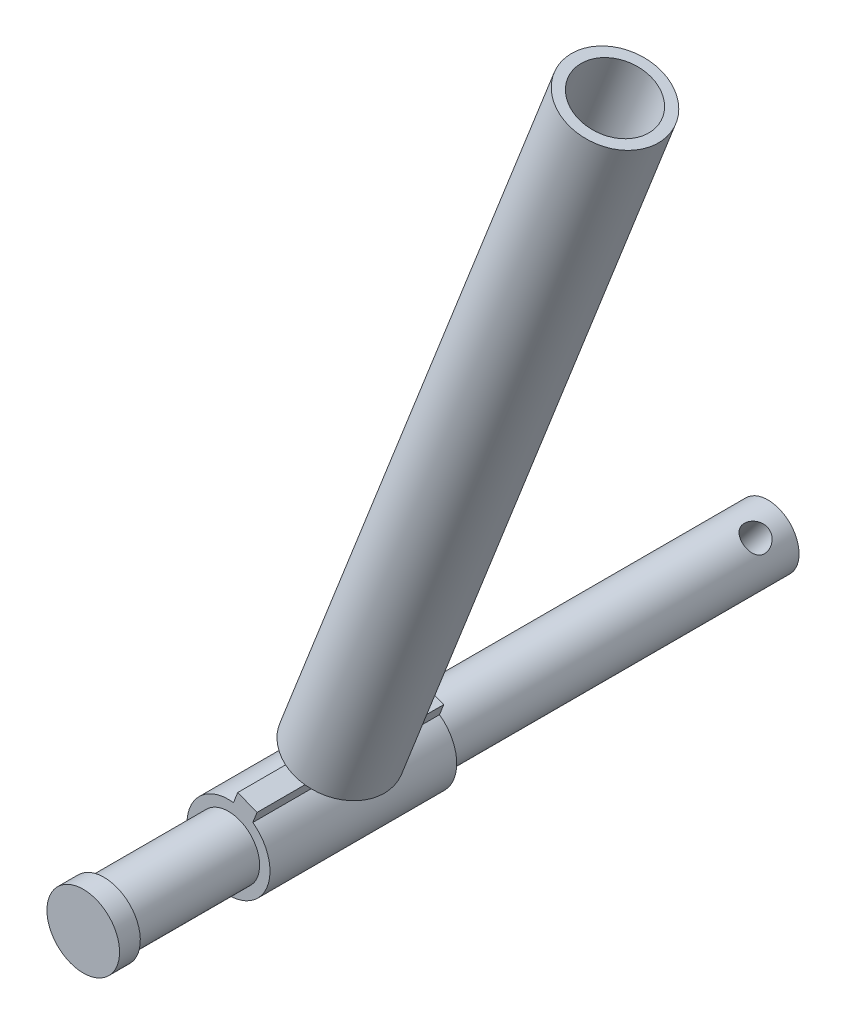
ISO-10303-21;
HEADER;
FILE_DESCRIPTION(('STEP AP214'),'2;1');
FILE_NAME('part.step','',(''),(''),'','','');
FILE_SCHEMA(('AUTOMOTIVE_DESIGN { 1 0 10303 214 1 1 1 1 }'));
ENDSEC;
DATA;
#1=APPLICATION_CONTEXT('core data for automotive mechanical design processes');
#2=APPLICATION_PROTOCOL_DEFINITION('international standard','automotive_design',2000,#1);
#3=PRODUCT_CONTEXT('',#1,'mechanical');
#4=PRODUCT('Part','Part','',(#3));
#5=PRODUCT_RELATED_PRODUCT_CATEGORY('part','',(#4));
#6=PRODUCT_DEFINITION_FORMATION('','',#4);
#7=PRODUCT_DEFINITION_CONTEXT('part definition',#1,'design');
#8=PRODUCT_DEFINITION('design','',#6,#7);
#9=PRODUCT_DEFINITION_SHAPE('','',#8);
#10=(LENGTH_UNIT() NAMED_UNIT(*) SI_UNIT(.MILLI.,.METRE.));
#11=(NAMED_UNIT(*) PLANE_ANGLE_UNIT() SI_UNIT($,.RADIAN.));
#12=(NAMED_UNIT(*) SI_UNIT($,.STERADIAN.) SOLID_ANGLE_UNIT());
#13=UNCERTAINTY_MEASURE_WITH_UNIT(LENGTH_MEASURE(1.E-05),#10,'distance_accuracy_value','');
#14=(GEOMETRIC_REPRESENTATION_CONTEXT(3) GLOBAL_UNCERTAINTY_ASSIGNED_CONTEXT((#13)) GLOBAL_UNIT_ASSIGNED_CONTEXT((#10,
#11,#12)) REPRESENTATION_CONTEXT('',''));
#15=CARTESIAN_POINT('',(0.,0.,0.));
#16=DIRECTION('',(0.,0.,1.));
#17=DIRECTION('',(1.,0.,0.));
#18=AXIS2_PLACEMENT_3D('',#15,#16,#17);
#19=CARTESIAN_POINT('',(-602.469625856057,201.390217780142,4239.13224485644));
#20=DIRECTION('',(0.,0.,-1.));
#21=DIRECTION('',(-0.622995613228405,-0.78222532936371,0.));
#22=AXIS2_PLACEMENT_3D('',#19,#20,#21);
#23=PLANE('',#22);
#24=CARTESIAN_POINT('',(-602.469625856057,201.390217780142,4239.13224485644));
#25=DIRECTION('',(0.,0.,1.));
#26=DIRECTION('',(0.622995613228405,0.78222532936371,0.));
#27=AXIS2_PLACEMENT_3D('',#24,#25,#26);
#28=CIRCLE('',#27,35.);
#29=CARTESIAN_POINT('',(-580.664779393063,228.768104307871,4239.13224485644));
#30=VERTEX_POINT('',#29);
#31=EDGE_CURVE('P0_E30',#30,#30,#28,.T.);
#32=ORIENTED_EDGE('',*,*,#31,.T.);
#33=EDGE_LOOP('',(#32));
#34=FACE_BOUND('',#33,.T.);
#35=ADVANCED_FACE('P0_F15',(#34),#23,.F.);
#36=CARTESIAN_POINT('',(-602.469625856057,201.390217780142,4239.13224485644));
#37=DIRECTION('',(0.,0.,1.));
#38=DIRECTION('',(0.622995613228405,0.78222532936371,0.));
#39=AXIS2_PLACEMENT_3D('',#36,#37,#38);
#40=CYLINDRICAL_SURFACE('',#39,35.);
#41=ORIENTED_EDGE('',*,*,#31,.F.);
#42=EDGE_LOOP('',(#41));
#43=FACE_BOUND('',#42,.T.);
#44=CARTESIAN_POINT('',(-602.469625856057,201.390217780142,4219.13224485644));
#45=DIRECTION('',(0.,0.,1.));
#46=DIRECTION('',(0.622995613228405,0.78222532936371,0.));
#47=AXIS2_PLACEMENT_3D('',#44,#45,#46);
#48=CIRCLE('',#47,35.);
#49=CARTESIAN_POINT('',(-580.664779393063,228.768104307871,4219.13224485644));
#50=VERTEX_POINT('',#49);
#51=EDGE_CURVE('P0_E34',#50,#50,#48,.T.);
#52=ORIENTED_EDGE('',*,*,#51,.T.);
#53=EDGE_LOOP('',(#52));
#54=FACE_BOUND('',#53,.T.);
#55=ADVANCED_FACE('P0_F59',(#43,#54),#40,.T.);
#56=CARTESIAN_POINT('',(-629.847512383787,223.195064243136,4219.13224485644));
#57=DIRECTION('',(0.,0.,1.));
#58=DIRECTION('',(0.622995613228405,0.78222532936371,0.));
#59=AXIS2_PLACEMENT_3D('',#56,#57,#58);
#60=PLANE('',#59);
#61=ORIENTED_EDGE('',*,*,#51,.F.);
#62=EDGE_LOOP('',(#61));
#63=FACE_BOUND('',#62,.T.);
#64=CARTESIAN_POINT('',(-602.469625856057,201.390217780142,4219.13224485644));
#65=DIRECTION('',(0.,0.,1.));
#66=DIRECTION('',(0.622995613228405,0.78222532936371,0.));
#67=AXIS2_PLACEMENT_3D('',#64,#65,#66);
#68=CIRCLE('',#67,30.);
#69=CARTESIAN_POINT('',(-583.779757459205,224.856977661053,4219.13224485644));
#70=VERTEX_POINT('',#69);
#71=EDGE_CURVE('P0_E70',#70,#70,#68,.T.);
#72=ORIENTED_EDGE('',*,*,#71,.T.);
#73=EDGE_LOOP('',(#72));
#74=FACE_BOUND('',#73,.T.);
#75=ADVANCED_FACE('P0_F56',(#63,#74),#60,.F.);
#76=CARTESIAN_POINT('',(-602.469625856057,201.390217780142,4239.13224485644));
#77=DIRECTION('',(0.,0.,1.));
#78=DIRECTION('',(0.622995613228405,0.78222532936371,0.));
#79=AXIS2_PLACEMENT_3D('',#76,#77,#78);
#80=CYLINDRICAL_SURFACE('',#79,30.);
#81=CARTESIAN_POINT('',(-621.159494252909,177.92345789923,3596.63224485644));
#82=CARTESIAN_POINT('',(-621.421482284155,178.132117989513,3596.63224711897));
#83=CARTESIAN_POINT('',(-621.680057320578,178.34524516387,3596.64572430932));
#84=CARTESIAN_POINT('',(-622.188423321345,178.778699783763,3596.69950779839));
#85=CARTESIAN_POINT('',(-622.438208621806,178.999031701638,3596.73983107441));
#86=CARTESIAN_POINT('',(-622.927807194417,179.44545067377,3596.84701447726));
#87=CARTESIAN_POINT('',(-623.167595780304,179.671549981808,3596.91393644166));
#88=CARTESIAN_POINT('',(-623.635147371634,180.126934896082,3597.07361676067));
#89=CARTESIAN_POINT('',(-623.862912227662,180.356220005085,3597.16637112552));
#90=CARTESIAN_POINT('',(-624.304631165095,180.815144435317,3597.37647442761));
#91=CARTESIAN_POINT('',(-624.518629292982,181.044779944805,3597.49373924101));
#92=CARTESIAN_POINT('',(-624.932872474032,181.503086780619,3597.7520293677));
#93=CARTESIAN_POINT('',(-625.13311703681,181.731758072292,3597.89305552757));
#94=CARTESIAN_POINT('',(-625.519209880109,182.185909246714,3598.19766066244));
#95=CARTESIAN_POINT('',(-625.705066395984,182.411390893817,3598.36122658493));
#96=CARTESIAN_POINT('',(-626.062280032031,182.857319228899,3598.70987659999));
#97=CARTESIAN_POINT('',(-626.233631443883,183.07776390995,3598.8949690967));
#98=CARTESIAN_POINT('',(-626.56909879548,183.521356360144,3599.29432871526));
#99=CARTESIAN_POINT('',(-626.732531585096,183.74417135548,3599.50953966012));
#100=CARTESIAN_POINT('',(-627.043424572472,184.179754067719,3599.96089227816));
#101=CARTESIAN_POINT('',(-627.190877438101,184.392517147418,3600.19704346984));
#102=CARTESIAN_POINT('',(-627.469906520271,184.805642863071,3600.68891726648));
#103=CARTESIAN_POINT('',(-627.601478036135,185.006001819055,3600.94464562961));
#104=CARTESIAN_POINT('',(-627.848894958806,185.391928792453,3601.47422870519));
#105=CARTESIAN_POINT('',(-627.964740360663,185.577496805209,3601.74808342335));
#106=CARTESIAN_POINT('',(-628.186299777155,185.94029598417,3602.32647908292));
#107=CARTESIAN_POINT('',(-628.291227130929,186.116658172214,3602.63186819507));
#108=CARTESIAN_POINT('',(-628.484235231575,186.447767303847,3603.25908009123));
#109=CARTESIAN_POINT('',(-628.572322954428,186.602523190863,3603.58089599997));
#110=CARTESIAN_POINT('',(-628.731926091562,186.887861935616,3604.23898238218));
#111=CARTESIAN_POINT('',(-628.803444429465,187.018449057047,3604.57525029319));
#112=CARTESIAN_POINT('',(-628.930110213646,187.253012862734,3605.25993631323));
#113=CARTESIAN_POINT('',(-628.98525887892,187.356991528356,3605.60835351538));
#114=CARTESIAN_POINT('',(-629.077060038233,187.531872655018,3606.29765177137));
#115=CARTESIAN_POINT('',(-629.114475006528,187.604126216704,3606.63808842232));
#116=CARTESIAN_POINT('',(-629.174675252514,187.721103552286,3607.32494369053));
#117=CARTESIAN_POINT('',(-629.197460982396,187.765828177099,3607.67136212256));
#118=CARTESIAN_POINT('',(-629.22843810938,187.82676907121,3608.3671844825));
#119=CARTESIAN_POINT('',(-629.236636418324,187.842998841951,3608.71658691762));
#120=CARTESIAN_POINT('',(-629.238473539474,187.846628647459,3609.41557072255));
#121=CARTESIAN_POINT('',(-629.232113118068,187.834030199779,3609.76515208198));
#122=CARTESIAN_POINT('',(-629.205873250039,187.782359243931,3610.43476999411));
#123=CARTESIAN_POINT('',(-629.187069239716,187.745393585696,3610.7550142397));
#124=CARTESIAN_POINT('',(-629.137017409223,187.647829652539,3611.39087425213));
#125=CARTESIAN_POINT('',(-629.105770324898,187.587232775096,3611.70649029154));
#126=CARTESIAN_POINT('',(-629.030774879996,187.443464677609,3612.33105502277));
#127=CARTESIAN_POINT('',(-628.987024784659,187.360290325078,3612.64000278298));
#128=CARTESIAN_POINT('',(-628.886943526315,187.172742193491,3613.24930214861));
#129=CARTESIAN_POINT('',(-628.830611870884,187.068367584701,3613.54965341706));
#130=CARTESIAN_POINT('',(-628.703938022011,186.837604927456,3614.14627497902));
#131=CARTESIAN_POINT('',(-628.633326042801,186.710800010213,3614.44232653354));
#132=CARTESIAN_POINT('',(-628.478694224009,186.438533286742,3615.02221221047));
#133=CARTESIAN_POINT('',(-628.394669501058,186.293064689162,3615.30604183511));
#134=CARTESIAN_POINT('',(-628.213040528292,185.985396916665,3615.85999776267));
#135=CARTESIAN_POINT('',(-628.115434464148,185.823195507164,3616.13012222814));
#136=CARTESIAN_POINT('',(-627.906456280501,185.484013502982,3616.65535576602));
#137=CARTESIAN_POINT('',(-627.795083388556,185.307032079192,3616.9104639947));
#138=CARTESIAN_POINT('',(-627.548335622131,184.924666809615,3617.42542517008));
#139=CARTESIAN_POINT('',(-627.411726206545,184.718147137876,3617.6838455239));
#140=CARTESIAN_POINT('',(-627.121932722506,184.292556815289,3618.18003124467));
#141=CARTESIAN_POINT('',(-626.968755116661,184.073491073752,3618.41780460044));
#142=CARTESIAN_POINT('',(-626.645540593293,183.625039010097,3618.87152983598));
#143=CARTESIAN_POINT('',(-626.475492580485,183.395645950826,3619.08746716368));
#144=CARTESIAN_POINT('',(-626.118698446247,182.929244641047,3619.49581477322));
#145=CARTESIAN_POINT('',(-625.931959156957,182.692239531554,3619.68823460566));
#146=CARTESIAN_POINT('',(-625.537345604947,182.207406513967,3620.05243024578));
#147=CARTESIAN_POINT('',(-625.329079158514,181.959455124243,3620.22361791769));
#148=CARTESIAN_POINT('',(-624.895665663451,181.46079606405,3620.53845424543));
#149=CARTESIAN_POINT('',(-624.670518182606,181.21008832315,3620.68210219581));
#150=CARTESIAN_POINT('',(-624.204270921059,180.708769265101,3620.94037860233));
#151=CARTESIAN_POINT('',(-623.963178317043,180.458157954953,3621.05502000331));
#152=CARTESIAN_POINT('',(-623.466169948327,179.959656169659,3621.25410679205));
#153=CARTESIAN_POINT('',(-623.210255311284,179.711765489232,3621.33855447345));
#154=CARTESIAN_POINT('',(-622.701846668615,179.236877344591,3621.47190450584));
#155=CARTESIAN_POINT('',(-622.450160441198,179.009550206144,3621.52271754466));
#156=CARTESIAN_POINT('',(-621.936867074245,178.561671866484,3621.59642229088));
#157=CARTESIAN_POINT('',(-621.67526035281,178.341120380418,3621.61931517364));
#158=CARTESIAN_POINT('',(-621.144129565625,177.908732446825,3621.63691821616));
#159=CARTESIAN_POINT('',(-620.874607482131,177.696893848685,3621.63163537317));
#160=CARTESIAN_POINT('',(-620.329749325245,177.283519196645,3621.59296341511));
#161=CARTESIAN_POINT('',(-620.054413381277,177.081982913742,3621.55957492508));
#162=CARTESIAN_POINT('',(-619.514040689571,176.700303448042,3621.46742410839));
#163=CARTESIAN_POINT('',(-619.249172479816,176.519594816812,3621.41000584398));
#164=CARTESIAN_POINT('',(-618.718354234068,176.169593499989,3621.27069905598));
#165=CARTESIAN_POINT('',(-618.452404243396,176.000300341264,3621.18881154732));
#166=CARTESIAN_POINT('',(-617.921474609259,175.67373428353,3621.00131338546));
#167=CARTESIAN_POINT('',(-617.656495039557,175.516462280907,3620.89570096547));
#168=CARTESIAN_POINT('',(-617.129571563591,175.214308142493,3620.66165511139));
#169=CARTESIAN_POINT('',(-616.867627768409,175.069426458841,3620.53322084504));
#170=CARTESIAN_POINT('',(-616.340777906559,174.787904348591,3620.25023051822));
#171=CARTESIAN_POINT('',(-616.076029662685,174.651655936167,3620.0949909568));
#172=CARTESIAN_POINT('',(-615.553924267991,174.392326306977,3619.76242189304));
#173=CARTESIAN_POINT('',(-615.296569890105,174.269249984198,3619.58508423291));
#174=CARTESIAN_POINT('',(-614.791364389855,174.036019076891,3619.20951582883));
#175=CARTESIAN_POINT('',(-614.543514846368,173.925866632982,3619.01128163402));
#176=CARTESIAN_POINT('',(-614.059358663014,173.718074629601,3618.59512969407));
#177=CARTESIAN_POINT('',(-613.823052584253,173.620435678013,3618.37721099356));
#178=CARTESIAN_POINT('',(-613.347471306833,173.430556571643,3617.90656612591));
#179=CARTESIAN_POINT('',(-613.109200026933,173.339206704615,3617.65246433251));
#180=CARTESIAN_POINT('',(-612.650686944408,173.169556165056,3617.12460968829));
#181=CARTESIAN_POINT('',(-612.430437869211,173.091250215516,3616.85086484866));
#182=CARTESIAN_POINT('',(-612.010112317298,172.94679062896,3616.28496230889));
#183=CARTESIAN_POINT('',(-611.810049716512,172.880645325688,3615.99279216461));
#184=CARTESIAN_POINT('',(-611.432758852658,172.759788428677,3615.39198044493));
#185=CARTESIAN_POINT('',(-611.255520886002,172.705071969924,3615.08334594856));
#186=CARTESIAN_POINT('',(-610.923755613615,172.605531920257,3614.44669974147));
#187=CARTESIAN_POINT('',(-610.769596687991,172.560864026555,3614.11847127502));
#188=CARTESIAN_POINT('',(-610.48951320555,172.4816963655,3613.44896660675));
#189=CARTESIAN_POINT('',(-610.363589146295,172.447196777332,3613.10769017512));
#190=CARTESIAN_POINT('',(-610.142230048023,172.387730097653,3612.41481984093));
#191=CARTESIAN_POINT('',(-610.046774022261,172.362756442242,3612.0632332232));
#192=CARTESIAN_POINT('',(-609.888052412892,172.321786502914,3611.35235803411));
#193=CARTESIAN_POINT('',(-609.824783801812,172.305789374669,3610.99307019043));
#194=CARTESIAN_POINT('',(-609.735297415765,172.283312109091,3610.29777920122));
#195=CARTESIAN_POINT('',(-609.706601393787,172.276193893622,3609.96211388237));
#196=CARTESIAN_POINT('',(-609.678230218126,172.269155838887,3609.289489979));
#197=CARTESIAN_POINT('',(-609.678553510497,172.269235614178,3608.95253146469));
#198=CARTESIAN_POINT('',(-609.708211603383,172.276593769814,3608.28002647428));
#199=CARTESIAN_POINT('',(-609.737542374069,172.28387115024,3607.94447980855));
#200=CARTESIAN_POINT('',(-609.824678185323,172.30576804059,3607.27735496567));
#201=CARTESIAN_POINT('',(-609.88248299708,172.320387491515,3606.94577675666));
#202=CARTESIAN_POINT('',(-610.022202807929,172.35638383906,3606.30444819574));
#203=CARTESIAN_POINT('',(-610.102861272397,172.377412034566,3605.99440302703));
#204=CARTESIAN_POINT('',(-610.287965112056,172.426745271931,3605.38198358697));
#205=CARTESIAN_POINT('',(-610.392418697208,172.455052825802,3605.07961200334));
#206=CARTESIAN_POINT('',(-610.623669390627,172.519368062465,3604.48439711523));
#207=CARTESIAN_POINT('',(-610.750466570195,172.555375769829,3604.19155384116));
#208=CARTESIAN_POINT('',(-611.024831776108,172.63558563291,3603.61692218361));
#209=CARTESIAN_POINT('',(-611.172401320223,172.679788387487,3603.33513460986));
#210=CARTESIAN_POINT('',(-611.496095711829,172.779848530578,3602.7674274788));
#211=CARTESIAN_POINT('',(-611.673403789469,172.836246748165,3602.48227762629));
#212=CARTESIAN_POINT('',(-612.047466837636,172.959534817087,3601.92742669338));
#213=CARTESIAN_POINT('',(-612.244222394632,173.026424984859,3601.65772607927));
#214=CARTESIAN_POINT('',(-612.655195577396,173.171400500578,3601.13505751352));
#215=CARTESIAN_POINT('',(-612.869417396121,173.249488540125,3600.88209360625));
#216=CARTESIAN_POINT('',(-613.313273538809,173.417523581661,3600.39421883975));
#217=CARTESIAN_POINT('',(-613.542909914949,173.507472164216,3600.15931039325));
#218=CARTESIAN_POINT('',(-614.0328292299,173.706878584822,3599.69234614424));
#219=CARTESIAN_POINT('',(-614.294125351153,173.81728188638,3599.46175405353));
#220=CARTESIAN_POINT('',(-614.829456255655,174.053061818535,3599.02444697617));
#221=CARTESIAN_POINT('',(-615.103486468779,174.178433102254,3598.81772351474));
#222=CARTESIAN_POINT('',(-615.661983497476,174.444764244571,3598.42944053703));
#223=CARTESIAN_POINT('',(-615.946457873147,174.58573555021,3598.24789972244));
#224=CARTESIAN_POINT('',(-616.52293521724,174.883431823155,3597.91169541693));
#225=CARTESIAN_POINT('',(-616.814937567675,175.040155500362,3597.75702972779));
#226=CARTESIAN_POINT('',(-617.398825111315,175.366593547177,3597.47833701068));
#227=CARTESIAN_POINT('',(-617.690632501414,175.536050447404,3597.35384591318));
#228=CARTESIAN_POINT('',(-618.276154930358,175.88981348428,3597.13349137765));
#229=CARTESIAN_POINT('',(-618.569870279627,176.074122095905,3597.03763272368));
#230=CARTESIAN_POINT('',(-619.15551586051,176.456244906136,3596.87586354881));
#231=CARTESIAN_POINT('',(-619.447448789068,176.654019701884,3596.80986963695));
#232=CARTESIAN_POINT('',(-620.027462590281,177.062292391624,3596.70825008318));
#233=CARTESIAN_POINT('',(-620.315546137238,177.272780824443,3596.67260214961));
#234=CARTESIAN_POINT('',(-620.694291142813,177.560078723277,3596.64563042869));
#235=CARTESIAN_POINT('',(-620.787883977407,177.631948540553,3596.64061219946));
#236=CARTESIAN_POINT('',(-620.974290774387,177.776846359797,3596.63391900961));
#237=CARTESIAN_POINT('',(-621.067104734541,177.849874365081,3596.63224405856));
#238=CARTESIAN_POINT('',(-621.159494252909,177.92345789923,3596.63224485644));
#239=B_SPLINE_CURVE_WITH_KNOTS('',3,(#81,#82,#83,#84,#85,#86,#87,#88,#89,#90,#91,#92,#93,#94,
#95,#96,#97,#98,#99,#100,#101,#102,#103,#104,#105,#106,#107,#108,#109,#110,#111,#112,#113,#114,
#115,#116,#117,#118,#119,#120,#121,#122,#123,#124,#125,#126,#127,#128,#129,#130,#131,#132,#133,
#134,#135,#136,#137,#138,#139,#140,#141,#142,#143,#144,#145,#146,#147,#148,#149,#150,#151,#152,
#153,#154,#155,#156,#157,#158,#159,#160,#161,#162,#163,#164,#165,#166,#167,#168,#169,#170,#171,
#172,#173,#174,#175,#176,#177,#178,#179,#180,#181,#182,#183,#184,#185,#186,#187,#188,#189,#190,
#191,#192,#193,#194,#195,#196,#197,#198,#199,#200,#201,#202,#203,#204,#205,#206,#207,#208,#209,
#210,#211,#212,#213,#214,#215,#216,#217,#218,#219,#220,#221,#222,#223,#224,#225,#226,#227,#228,
#229,#230,#231,#232,#233,#234,#235,#236,#237,#238),.UNSPECIFIED.,.T.,.F.,(4,2,2,2,2,2,2,2,2,2,2,
2,2,2,2,2,2,2,2,2,2,2,2,2,2,2,2,2,2,2,2,2,2,2,2,2,2,2,2,2,2,2,2,2,2,2,2,2,2,2,2,2,2,2,2,2,2,2,2,
2,2,2,2,2,2,2,2,2,2,2,2,2,2,2,2,2,2,2,4),(0.,1.00466377798185,2.00996350323173,3.01761418533847,
4.02510932397558,5.02920174469292,6.03332994784078,7.03687909749923,8.04082136416411,
9.0904076316209,10.1404734638638,11.1908493439957,12.2412255547517,13.343658924492,
14.4456346059817,15.5474156984468,16.6491147242288,17.6977885376054,18.7464299349201,
19.7945743304077,20.8426635516396,21.8102841128417,22.7778474605276,23.7455451204138,
24.7132806612804,25.7013724558905,26.6898248231238,27.6784093645777,28.6670493997115,
29.7395376959963,30.8116091546478,31.8843904244264,32.956734572654,34.0541608742381,
35.1516152834554,36.2485790611892,37.3454594916022,38.3729497094307,39.4003966716773,
40.427588486896,41.4547574593452,42.4308578770206,43.4069178137517,44.3830504617576,
45.359218714891,46.3654951807195,47.3721442322,48.3789597832712,49.3858242252434,
50.4649453336419,51.5436288101092,52.623048779763,53.7020083227622,54.7966829194204,
55.8913768051429,56.9853150171764,58.079150316951,59.0887421835191,60.0982799878473,
61.1076775630543,62.1170670271052,63.0791633380625,64.0415921024082,65.0040239380319,
65.9665261320114,66.9868817454613,68.0072681387293,69.0279002116256,70.0486684342963,
71.1440527390739,72.2390469136825,73.3348499727185,74.4305633598348,75.508170036637,
76.5859566649334,77.660714947081,78.7346830461985,79.0889745622273,79.4432670928012),.UNSPECIFIED.);
#240=CARTESIAN_POINT('',(-621.159494252909,177.92345789923,3596.63224485644));
#241=VERTEX_POINT('',#240);
#242=EDGE_CURVE('P0_E10',#241,#241,#239,.T.);
#243=ORIENTED_EDGE('',*,*,#242,.T.);
#244=EDGE_LOOP('',(#243));
#245=FACE_BOUND('',#244,.T.);
#246=CARTESIAN_POINT('',(-583.779757459205,224.856977661053,3596.63224485644));
#247=CARTESIAN_POINT('',(-583.517769427959,224.64831757077,3596.63224711897));
#248=CARTESIAN_POINT('',(-583.259194391536,224.435190396413,3596.64572430932));
#249=CARTESIAN_POINT('',(-582.750828390769,224.00173577652,3596.69950779839));
#250=CARTESIAN_POINT('',(-582.501043090308,223.781403858645,3596.73983107441));
#251=CARTESIAN_POINT('',(-582.011444517697,223.334984886513,3596.84701447726));
#252=CARTESIAN_POINT('',(-581.77165593181,223.108885578475,3596.91393644166));
#253=CARTESIAN_POINT('',(-581.30410434048,222.653500664201,3597.07361676067));
#254=CARTESIAN_POINT('',(-581.076339484452,222.424215555198,3597.16637112552));
#255=CARTESIAN_POINT('',(-580.634620547019,221.965291124966,3597.37647442761));
#256=CARTESIAN_POINT('',(-580.420622419132,221.735655615478,3597.49373924101));
#257=CARTESIAN_POINT('',(-580.006379238082,221.277348779665,3597.7520293677));
#258=CARTESIAN_POINT('',(-579.806134675304,221.048677487991,3597.89305552757));
#259=CARTESIAN_POINT('',(-579.420041832005,220.594526313569,3598.19766066244));
#260=CARTESIAN_POINT('',(-579.23418531613,220.369044666466,3598.36122658493));
#261=CARTESIAN_POINT('',(-578.876971680083,219.923116331384,3598.70987659999));
#262=CARTESIAN_POINT('',(-578.705620268231,219.702671650333,3598.8949690967));
#263=CARTESIAN_POINT('',(-578.370152916634,219.25907920014,3599.29432871526));
#264=CARTESIAN_POINT('',(-578.206720127018,219.036264204803,3599.50953966012));
#265=CARTESIAN_POINT('',(-577.895827139642,218.600681492565,3599.96089227816));
#266=CARTESIAN_POINT('',(-577.748374274013,218.387918412865,3600.19704346984));
#267=CARTESIAN_POINT('',(-577.469345191843,217.974792697212,3600.68891726648));
#268=CARTESIAN_POINT('',(-577.337773675979,217.774433741228,3600.94464562961));
#269=CARTESIAN_POINT('',(-577.090356753308,217.388506767831,3601.47422870519));
#270=CARTESIAN_POINT('',(-576.974511351451,217.202938755074,3601.74808342335));
#271=CARTESIAN_POINT('',(-576.752951934959,216.840139576113,3602.32647908292));
#272=CARTESIAN_POINT('',(-576.648024581185,216.663777388069,3602.63186819507));
#273=CARTESIAN_POINT('',(-576.455016480539,216.332668256436,3603.25908009123));
#274=CARTESIAN_POINT('',(-576.366928757686,216.17791236942,3603.58089599997));
#275=CARTESIAN_POINT('',(-576.207325620552,215.892573624667,3604.23898238218));
#276=CARTESIAN_POINT('',(-576.135807282649,215.761986503236,3604.57525029319));
#277=CARTESIAN_POINT('',(-576.009141498468,215.527422697549,3605.25993631323));
#278=CARTESIAN_POINT('',(-575.953992833194,215.423444031927,3605.60835351538));
#279=CARTESIAN_POINT('',(-575.862191673881,215.248562905265,3606.29765177137));
#280=CARTESIAN_POINT('',(-575.824776705586,215.176309343579,3606.63808842232));
#281=CARTESIAN_POINT('',(-575.7645764596,215.059332007997,3607.32494369053));
#282=CARTESIAN_POINT('',(-575.741790729718,215.014607383185,3607.67136212256));
#283=CARTESIAN_POINT('',(-575.710813602734,214.953666489073,3608.3671844825));
#284=CARTESIAN_POINT('',(-575.70261529379,214.937436718333,3608.71658691762));
#285=CARTESIAN_POINT('',(-575.70077817264,214.933806912824,3609.41557072255));
#286=CARTESIAN_POINT('',(-575.707138594046,214.946405360504,3609.76515208198));
#287=CARTESIAN_POINT('',(-575.733378462075,214.998076316352,3610.43476999411));
#288=CARTESIAN_POINT('',(-575.752182472398,215.035041974587,3610.7550142397));
#289=CARTESIAN_POINT('',(-575.802234302891,215.132605907744,3611.39087425213));
#290=CARTESIAN_POINT('',(-575.833481387216,215.193202785187,3611.70649029154));
#291=CARTESIAN_POINT('',(-575.908476832118,215.336970882674,3612.33105502277));
#292=CARTESIAN_POINT('',(-575.952226927456,215.420145235205,3612.64000278298));
#293=CARTESIAN_POINT('',(-576.052308185799,215.607693366792,3613.24930214861));
#294=CARTESIAN_POINT('',(-576.10863984123,215.712067975582,3613.54965341706));
#295=CARTESIAN_POINT('',(-576.235313690103,215.942830632827,3614.14627497902));
#296=CARTESIAN_POINT('',(-576.305925669313,216.06963555007,3614.44232653354));
#297=CARTESIAN_POINT('',(-576.460557488105,216.341902273542,3615.02221221047));
#298=CARTESIAN_POINT('',(-576.544582211056,216.487370871121,3615.30604183511));
#299=CARTESIAN_POINT('',(-576.726211183822,216.795038643618,3615.85999776267));
#300=CARTESIAN_POINT('',(-576.823817247966,216.957240053119,3616.13012222814));
#301=CARTESIAN_POINT('',(-577.032795431613,217.296422057301,3616.65535576602));
#302=CARTESIAN_POINT('',(-577.144168323558,217.473403481091,3616.9104639947));
#303=CARTESIAN_POINT('',(-577.390916089983,217.855768750668,3617.42542517008));
#304=CARTESIAN_POINT('',(-577.527525505569,218.062288422407,3617.6838455239));
#305=CARTESIAN_POINT('',(-577.817318989608,218.487878744994,3618.18003124467));
#306=CARTESIAN_POINT('',(-577.970496595453,218.706944486531,3618.41780460044));
#307=CARTESIAN_POINT('',(-578.293711118821,219.155396550186,3618.87152983598));
#308=CARTESIAN_POINT('',(-578.463759131629,219.384789609457,3619.08746716368));
#309=CARTESIAN_POINT('',(-578.820553265867,219.851190919236,3619.49581477322));
#310=CARTESIAN_POINT('',(-579.007292555157,220.088196028729,3619.68823460566));
#311=CARTESIAN_POINT('',(-579.401906107167,220.573029046316,3620.05243024578));
#312=CARTESIAN_POINT('',(-579.6101725536,220.82098043604,3620.22361791769));
#313=CARTESIAN_POINT('',(-580.043586048663,221.319639496233,3620.53845424543));
#314=CARTESIAN_POINT('',(-580.268733529508,221.570347237133,3620.68210219581));
#315=CARTESIAN_POINT('',(-580.734980791055,222.071666295182,3620.94037860233));
#316=CARTESIAN_POINT('',(-580.976073395071,222.32227760533,3621.05502000331));
#317=CARTESIAN_POINT('',(-581.473081763787,222.820779390624,3621.25410679205));
#318=CARTESIAN_POINT('',(-581.72899640083,223.068670071051,3621.33855447345));
#319=CARTESIAN_POINT('',(-582.237405043499,223.543558215692,3621.47190450584));
#320=CARTESIAN_POINT('',(-582.489091270916,223.770885354139,3621.52271754466));
#321=CARTESIAN_POINT('',(-583.002384637869,224.218763693799,3621.59642229088));
#322=CARTESIAN_POINT('',(-583.263991359304,224.439315179865,3621.61931517364));
#323=CARTESIAN_POINT('',(-583.795122146489,224.871703113458,3621.63691821616));
#324=CARTESIAN_POINT('',(-584.064644229983,225.083541711598,3621.63163537317));
#325=CARTESIAN_POINT('',(-584.609502386869,225.496916363638,3621.59296341511));
#326=CARTESIAN_POINT('',(-584.884838330837,225.698452646541,3621.55957492508));
#327=CARTESIAN_POINT('',(-585.425211022543,226.080132112241,3621.46742410839));
#328=CARTESIAN_POINT('',(-585.690079232298,226.260840743471,3621.41000584398));
#329=CARTESIAN_POINT('',(-586.220897478046,226.610842060294,3621.27069905598));
#330=CARTESIAN_POINT('',(-586.486847468718,226.780135219019,3621.18881154732));
#331=CARTESIAN_POINT('',(-587.017777102855,227.106701276753,3621.00131338546));
#332=CARTESIAN_POINT('',(-587.282756672558,227.263973279376,3620.89570096547));
#333=CARTESIAN_POINT('',(-587.809680148523,227.56612741779,3620.66165511139));
#334=CARTESIAN_POINT('',(-588.071623943705,227.711009101442,3620.53322084504));
#335=CARTESIAN_POINT('',(-588.598473805555,227.992531211692,3620.25023051822));
#336=CARTESIAN_POINT('',(-588.863222049429,228.128779624116,3620.0949909568));
#337=CARTESIAN_POINT('',(-589.385327444123,228.388109253306,3619.76242189304));
#338=CARTESIAN_POINT('',(-589.642681822009,228.511185576085,3619.58508423291));
#339=CARTESIAN_POINT('',(-590.147887322259,228.744416483392,3619.20951582883));
#340=CARTESIAN_POINT('',(-590.395736865746,228.854568927301,3619.01128163402));
#341=CARTESIAN_POINT('',(-590.8798930491,229.062360930682,3618.59512969407));
#342=CARTESIAN_POINT('',(-591.116199127861,229.15999988227,3618.37721099356));
#343=CARTESIAN_POINT('',(-591.591780405281,229.34987898864,3617.90656612591));
#344=CARTESIAN_POINT('',(-591.830051685181,229.441228855668,3617.65246433251));
#345=CARTESIAN_POINT('',(-592.288564767706,229.610879395227,3617.12460968829));
#346=CARTESIAN_POINT('',(-592.508813842903,229.689185344767,3616.85086484866));
#347=CARTESIAN_POINT('',(-592.929139394816,229.833644931324,3616.28496230889));
#348=CARTESIAN_POINT('',(-593.129201995602,229.899790234596,3615.99279216461));
#349=CARTESIAN_POINT('',(-593.506492859457,230.020647131606,3615.39198044492));
#350=CARTESIAN_POINT('',(-593.683730826112,230.075363590359,3615.08334594856));
#351=CARTESIAN_POINT('',(-594.015496098499,230.174903640026,3614.44669974147));
#352=CARTESIAN_POINT('',(-594.169655024123,230.219571533728,3614.11847127502));
#353=CARTESIAN_POINT('',(-594.449738506564,230.298739194783,3613.44896660675));
#354=CARTESIAN_POINT('',(-594.57566256582,230.333238782951,3613.10769017512));
#355=CARTESIAN_POINT('',(-594.797021664091,230.392705462631,3612.41481984093));
#356=CARTESIAN_POINT('',(-594.892477689853,230.417679118041,3612.0632332232));
#357=CARTESIAN_POINT('',(-595.051199299223,230.45864905737,3611.35235803411));
#358=CARTESIAN_POINT('',(-595.114467910302,230.474646185614,3610.99307019043));
#359=CARTESIAN_POINT('',(-595.203954296349,230.497123451192,3610.29777920122));
#360=CARTESIAN_POINT('',(-595.232650318327,230.504241666661,3609.96211388237));
#361=CARTESIAN_POINT('',(-595.261021493988,230.511279721396,3609.289489979));
#362=CARTESIAN_POINT('',(-595.260698201617,230.511199946105,3608.95253146469));
#363=CARTESIAN_POINT('',(-595.231040108731,230.503841790469,3608.28002647428));
#364=CARTESIAN_POINT('',(-595.201709338045,230.496564410043,3607.94447980855));
#365=CARTESIAN_POINT('',(-595.114573526791,230.474667519693,3607.27735496567));
#366=CARTESIAN_POINT('',(-595.056768715034,230.460048068768,3606.94577675666));
#367=CARTESIAN_POINT('',(-594.917048904185,230.424051721223,3606.30444819574));
#368=CARTESIAN_POINT('',(-594.836390439717,230.403023525717,3605.99440302703));
#369=CARTESIAN_POINT('',(-594.651286600058,230.353690288352,3605.38198358697));
#370=CARTESIAN_POINT('',(-594.546833014906,230.325382734481,3605.07961200334));
#371=CARTESIAN_POINT('',(-594.315582321487,230.261067497818,3604.48439711523));
#372=CARTESIAN_POINT('',(-594.188785141919,230.225059790454,3604.19155384116));
#373=CARTESIAN_POINT('',(-593.914419936006,230.144849927373,3603.61692218361));
#374=CARTESIAN_POINT('',(-593.766850391891,230.100647172796,3603.33513460986));
#375=CARTESIAN_POINT('',(-593.443156000286,230.000587029705,3602.7674274788));
#376=CARTESIAN_POINT('',(-593.265847922645,229.944188812118,3602.48227762629));
#377=CARTESIAN_POINT('',(-592.891784874478,229.820900743196,3601.92742669338));
#378=CARTESIAN_POINT('',(-592.695029317482,229.754010575424,3601.65772607927));
#379=CARTESIAN_POINT('',(-592.284056134718,229.609035059705,3601.13505751352));
#380=CARTESIAN_POINT('',(-592.069834315993,229.530947020157,3600.88209360625));
#381=CARTESIAN_POINT('',(-591.625978173305,229.362911978622,3600.39421883975));
#382=CARTESIAN_POINT('',(-591.396341797165,229.272963396067,3600.15931039325));
#383=CARTESIAN_POINT('',(-590.906422482214,229.073556975461,3599.69234614424));
#384=CARTESIAN_POINT('',(-590.645126360961,228.963153673903,3599.46175405353));
#385=CARTESIAN_POINT('',(-590.109795456459,228.727373741748,3599.02444697617));
#386=CARTESIAN_POINT('',(-589.835765243335,228.602002458029,3598.81772351474));
#387=CARTESIAN_POINT('',(-589.277268214638,228.335671315712,3598.42944053703));
#388=CARTESIAN_POINT('',(-588.992793838967,228.194700010074,3598.24789972244));
#389=CARTESIAN_POINT('',(-588.416316494874,227.897003737128,3597.91169541693));
#390=CARTESIAN_POINT('',(-588.124314144439,227.740280059921,3597.75702972779));
#391=CARTESIAN_POINT('',(-587.540426600799,227.413842013106,3597.47833701068));
#392=CARTESIAN_POINT('',(-587.2486192107,227.24438511288,3597.35384591317));
#393=CARTESIAN_POINT('',(-586.663096781756,226.890622076003,3597.13349137765));
#394=CARTESIAN_POINT('',(-586.369381432487,226.706313464378,3597.03763272368));
#395=CARTESIAN_POINT('',(-585.783735851604,226.324190654147,3596.87586354881));
#396=CARTESIAN_POINT('',(-585.491802923046,226.126415858399,3596.80986963695));
#397=CARTESIAN_POINT('',(-584.911789121833,225.718143168659,3596.70825008318));
#398=CARTESIAN_POINT('',(-584.623705574876,225.50765473584,3596.67260214961));
#399=CARTESIAN_POINT('',(-584.244960569301,225.220356837006,3596.64563042869));
#400=CARTESIAN_POINT('',(-584.151367734707,225.14848701973,3596.64061219946));
#401=CARTESIAN_POINT('',(-583.964960937727,225.003589200486,3596.63391900961));
#402=CARTESIAN_POINT('',(-583.872146977573,224.930561195202,3596.63224405856));
#403=CARTESIAN_POINT('',(-583.779757459205,224.856977661053,3596.63224485644));
#404=B_SPLINE_CURVE_WITH_KNOTS('',3,(#246,#247,#248,#249,#250,#251,#252,#253,#254,#255,#256,
#257,#258,#259,#260,#261,#262,#263,#264,#265,#266,#267,#268,#269,#270,#271,#272,#273,#274,#275,
#276,#277,#278,#279,#280,#281,#282,#283,#284,#285,#286,#287,#288,#289,#290,#291,#292,#293,#294,
#295,#296,#297,#298,#299,#300,#301,#302,#303,#304,#305,#306,#307,#308,#309,#310,#311,#312,#313,
#314,#315,#316,#317,#318,#319,#320,#321,#322,#323,#324,#325,#326,#327,#328,#329,#330,#331,#332,
#333,#334,#335,#336,#337,#338,#339,#340,#341,#342,#343,#344,#345,#346,#347,#348,#349,#350,#351,
#352,#353,#354,#355,#356,#357,#358,#359,#360,#361,#362,#363,#364,#365,#366,#367,#368,#369,#370,
#371,#372,#373,#374,#375,#376,#377,#378,#379,#380,#381,#382,#383,#384,#385,#386,#387,#388,#389,
#390,#391,#392,#393,#394,#395,#396,#397,#398,#399,#400,#401,#402,#403),.UNSPECIFIED.,.T.,.F.,(4,
2,2,2,2,2,2,2,2,2,2,2,2,2,2,2,2,2,2,2,2,2,2,2,2,2,2,2,2,2,2,2,2,2,2,2,2,2,2,2,2,2,2,2,2,2,2,2,2,
2,2,2,2,2,2,2,2,2,2,2,2,2,2,2,2,2,2,2,2,2,2,2,2,2,2,2,2,2,4),(0.,1.00466377798183,
2.00996350323161,3.01761418533841,4.02510932397556,5.02920174469291,6.03332994784076,
7.03687909749924,8.04082136416411,9.09040763162077,10.1404734638638,11.1908493439957,
12.2412255547517,13.343658924492,14.4456346059816,15.5474156984468,16.6491147242288,
17.6977885376054,18.7464299349201,19.7945743304081,20.8426635516395,21.8102841128417,
22.7778474605275,23.7455451204138,24.7132806612803,25.70137245589,26.6898248231237,
27.6784093645776,28.6670493997115,29.7395376959962,30.8116091546477,31.8843904244263,
32.9567345726539,34.054160874238,35.1516152834553,36.2485790611891,37.3454594916021,
38.3729497094307,39.4003966716772,40.4275884868957,41.4547574593451,42.4308578770205,
43.4069178137516,44.3830504617576,45.3592187148909,46.365495180719,47.3721442321999,
48.3789597832709,49.3858242252433,50.4649453336418,51.5436288101091,52.6230487797634,
53.7020083227621,54.7966829194203,55.8913768051428,56.9853150171763,58.0791503169509,
59.088742183519,60.0982799878472,61.1076775630542,62.1170670271051,63.0791633380619,
64.0415921024081,65.0040239380319,65.9665261320114,66.9868817454613,68.0072681387292,
69.0279002116256,70.0486684342962,71.1440527390739,72.2390469136824,73.3348499727183,
74.4305633598348,75.5081700366373,76.5859566649337,77.6607149470811,78.7346830461985,
79.0889745622273,79.4432670928012),.UNSPECIFIED.);
#405=CARTESIAN_POINT('',(-583.779757459205,224.856977661053,3596.63224485644));
#406=VERTEX_POINT('',#405);
#407=EDGE_CURVE('P0_E26',#406,#406,#404,.T.);
#408=ORIENTED_EDGE('',*,*,#407,.T.);
#409=EDGE_LOOP('',(#408));
#410=FACE_BOUND('',#409,.T.);
#411=ORIENTED_EDGE('',*,*,#71,.F.);
#412=EDGE_LOOP('',(#411));
#413=FACE_BOUND('',#412,.T.);
#414=CARTESIAN_POINT('',(-602.469625856057,201.390217780142,3579.13224485644));
#415=DIRECTION('',(0.,0.,1.));
#416=DIRECTION('',(0.622995613228405,0.78222532936371,0.));
#417=AXIS2_PLACEMENT_3D('',#414,#415,#416);
#418=CIRCLE('',#417,30.);
#419=CARTESIAN_POINT('',(-583.779757459205,224.856977661053,3579.13224485644));
#420=VERTEX_POINT('',#419);
#421=EDGE_CURVE('P0_E72',#420,#420,#418,.T.);
#422=ORIENTED_EDGE('',*,*,#421,.T.);
#423=EDGE_LOOP('',(#422));
#424=FACE_BOUND('',#423,.T.);
#425=ADVANCED_FACE('P0_F40',(#245,#410,#413,#424),#80,.T.);
#426=CARTESIAN_POINT('',(-625.936385736968,220.080086176994,3579.13224485644));
#427=DIRECTION('',(0.,0.,1.));
#428=DIRECTION('',(0.622995613228405,0.78222532936371,0.));
#429=AXIS2_PLACEMENT_3D('',#426,#427,#428);
#430=PLANE('',#429);
#431=ORIENTED_EDGE('',*,*,#421,.F.);
#432=EDGE_LOOP('',(#431));
#433=FACE_BOUND('',#432,.T.);
#434=ADVANCED_FACE('P0_F47',(#433),#430,.F.);
#435=CARTESIAN_POINT('',(-621.159494252909,177.92345789923,3609.13224485644));
#436=DIRECTION('',(0.622995613228405,0.78222532936371,0.));
#437=DIRECTION('',(0.,0.,-1.));
#438=AXIS2_PLACEMENT_3D('',#435,#436,#437);
#439=CYLINDRICAL_SURFACE('',#438,12.5);
#440=ORIENTED_EDGE('',*,*,#407,.F.);
#441=EDGE_LOOP('',(#440));
#442=FACE_BOUND('',#441,.T.);
#443=ORIENTED_EDGE('',*,*,#242,.F.);
#444=EDGE_LOOP('',(#443));
#445=FACE_BOUND('',#444,.T.);
#446=ADVANCED_FACE('P0_F44',(#442,#445),#439,.F.);
#447=CLOSED_SHELL('',(#35,#55,#75,#425,#434,#446));
#448=MANIFOLD_SOLID_BREP('P0_B1',#447);
#449=CARTESIAN_POINT('',(-584.239551062591,247.948400444681,4009.13224485643));
#450=DIRECTION('',(0.364601495869333,0.931163653290787,0.));
#451=DIRECTION('',(0.,0.,-1.));
#452=AXIS2_PLACEMENT_3D('',#449,#450,#451);
#453=PLANE('',#452);
#454=DIRECTION('',(0.,0.,1.));
#455=VECTOR('',#454,1.);
#456=CARTESIAN_POINT('',(-574.927914529683,244.302385485988,3919.13224485644));
#457=LINE('',#456,#455);
#458=CARTESIAN_POINT('',(-574.927914529683,244.302385485988,3965.25742291947));
#459=VERTEX_POINT('',#458);
#460=CARTESIAN_POINT('',(-574.927914529683,244.302385485988,4053.0070667934));
#461=VERTEX_POINT('',#460);
#462=EDGE_CURVE('P1_E10',#459,#461,#457,.T.);
#463=ORIENTED_EDGE('',*,*,#462,.F.);
#464=CARTESIAN_POINT('',(-584.239551062591,247.948400444681,4009.13224485643));
#465=DIRECTION('',(0.364601495869333,0.931163653290787,0.));
#466=DIRECTION('',(0.,0.,-1.));
#467=AXIS2_PLACEMENT_3D('',#464,#465,#466);
#468=CIRCLE('',#467,45.);
#469=EDGE_CURVE('P1_E114',#461,#459,#468,.T.);
#470=ORIENTED_EDGE('',*,*,#469,.F.);
#471=EDGE_LOOP('',(#463,#470));
#472=FACE_BOUND('',#471,.T.);
#473=ADVANCED_FACE('P1_F16',(#472),#453,.F.);
#474=CARTESIAN_POINT('',(-319.903466557324,923.042049080501,4009.13224485643));
#475=DIRECTION('',(-0.364601495869333,-0.931163653290787,0.));
#476=DIRECTION('',(0.,0.,1.));
#477=AXIS2_PLACEMENT_3D('',#474,#475,#476);
#478=CYLINDRICAL_SURFACE('',#477,45.);
#479=CARTESIAN_POINT('',(-319.903466557324,923.042049080501,4009.13224485643));
#480=DIRECTION('',(0.364601495869333,0.931163653290787,0.));
#481=DIRECTION('',(0.,0.,-1.));
#482=AXIS2_PLACEMENT_3D('',#479,#480,#481);
#483=CIRCLE('',#482,45.);
#484=CARTESIAN_POINT('',(-319.903466557324,923.042049080501,3964.13224485643));
#485=VERTEX_POINT('',#484);
#486=EDGE_CURVE('P1_E103',#485,#485,#483,.T.);
#487=ORIENTED_EDGE('',*,*,#486,.F.);
#488=EDGE_LOOP('',(#487));
#489=FACE_BOUND('',#488,.T.);
#490=CARTESIAN_POINT('',(-593.551187595499,251.594415403374,3965.25742291947));
#491=VERTEX_POINT('',#490);
#492=CARTESIAN_POINT('',(-593.551187595499,251.594415403374,4053.0070667934));
#493=VERTEX_POINT('',#492);
#494=EDGE_CURVE('P1_E20',#491,#493,#468,.T.);
#495=ORIENTED_EDGE('',*,*,#494,.T.);
#496=EDGE_CURVE('P1_E110',#493,#461,#468,.T.);
#497=ORIENTED_EDGE('',*,*,#496,.T.);
#498=ORIENTED_EDGE('',*,*,#469,.T.);
#499=EDGE_CURVE('P1_E94',#459,#491,#468,.T.);
#500=ORIENTED_EDGE('',*,*,#499,.T.);
#501=EDGE_LOOP('',(#495,#497,#498,#500));
#502=FACE_BOUND('',#501,.T.);
#503=ADVANCED_FACE('P1_F18',(#489,#502),#478,.T.);
#504=CARTESIAN_POINT('',(-319.903466557324,923.042049080501,4009.13224485643));
#505=DIRECTION('',(0.364601495869333,0.931163653290787,0.));
#506=DIRECTION('',(0.,0.,-1.));
#507=AXIS2_PLACEMENT_3D('',#504,#505,#506);
#508=PLANE('',#507);
#509=CARTESIAN_POINT('',(-319.903466557324,923.042049080501,4009.13224485643));
#510=DIRECTION('',(0.364601495869333,0.931163653290787,0.));
#511=DIRECTION('',(0.,0.,-1.));
#512=AXIS2_PLACEMENT_3D('',#509,#510,#511);
#513=CIRCLE('',#512,35.);
#514=CARTESIAN_POINT('',(-319.903466557324,923.042049080501,3974.13224485643));
#515=VERTEX_POINT('',#514);
#516=EDGE_CURVE('P1_E95',#515,#515,#513,.T.);
#517=ORIENTED_EDGE('',*,*,#516,.F.);
#518=EDGE_LOOP('',(#517));
#519=FACE_BOUND('',#518,.T.);
#520=ORIENTED_EDGE('',*,*,#486,.T.);
#521=EDGE_LOOP('',(#520));
#522=FACE_BOUND('',#521,.T.);
#523=ADVANCED_FACE('P1_F166',(#519,#522),#508,.T.);
#524=ORIENTED_EDGE('',*,*,#494,.F.);
#525=DIRECTION('',(0.,0.,1.));
#526=VECTOR('',#525,1.);
#527=CARTESIAN_POINT('',(-593.551187595499,251.594415403374,3919.13224485644));
#528=LINE('',#527,#526);
#529=EDGE_CURVE('P1_E25',#491,#493,#528,.T.);
#530=ORIENTED_EDGE('',*,*,#529,.T.);
#531=EDGE_LOOP('',(#524,#530));
#532=FACE_BOUND('',#531,.T.);
#533=ADVANCED_FACE('P1_F162',(#532),#453,.F.);
#534=CARTESIAN_POINT('',(-538.664364078924,364.343857106029,4009.13224485643));
#535=DIRECTION('',(0.364601495869333,0.931163653290787,0.));
#536=DIRECTION('',(0.,0.,-1.));
#537=AXIS2_PLACEMENT_3D('',#534,#535,#536);
#538=CYLINDRICAL_SURFACE('',#537,35.);
#539=CARTESIAN_POINT('',(-538.664364078924,364.343857106029,4009.13224485643));
#540=DIRECTION('',(0.364601495869333,0.931163653290787,0.));
#541=DIRECTION('',(0.,0.,-1.));
#542=AXIS2_PLACEMENT_3D('',#539,#540,#541);
#543=CIRCLE('',#542,35.);
#544=CARTESIAN_POINT('',(-538.664364078924,364.343857106029,3974.13224485643));
#545=VERTEX_POINT('',#544);
#546=EDGE_CURVE('P1_E97',#545,#545,#543,.T.);
#547=ORIENTED_EDGE('',*,*,#546,.F.);
#548=EDGE_LOOP('',(#547));
#549=FACE_BOUND('',#548,.T.);
#550=ORIENTED_EDGE('',*,*,#516,.T.);
#551=EDGE_LOOP('',(#550));
#552=FACE_BOUND('',#551,.T.);
#553=ADVANCED_FACE('P1_F170',(#549,#552),#538,.F.);
#554=CARTESIAN_POINT('',(-538.664364078924,364.343857106029,4009.13224485643));
#555=DIRECTION('',(0.364601495869333,0.931163653290787,0.));
#556=DIRECTION('',(0.,0.,-1.));
#557=AXIS2_PLACEMENT_3D('',#554,#555,#556);
#558=PLANE('',#557);
#559=ORIENTED_EDGE('',*,*,#546,.T.);
#560=EDGE_LOOP('',(#559));
#561=FACE_BOUND('',#560,.T.);
#562=ADVANCED_FACE('P1_F176',(#561),#558,.T.);
#563=CARTESIAN_POINT('',(-593.551187595499,251.594415403374,3919.13224485644));
#564=DIRECTION('',(-0.364601495869333,-0.931163653290787,0.));
#565=DIRECTION('',(0.,0.,1.));
#566=AXIS2_PLACEMENT_3D('',#563,#564,#565);
#567=PLANE('',#566);
#568=ORIENTED_EDGE('',*,*,#496,.F.);
#569=CARTESIAN_POINT('',(-593.551187595499,251.594415403374,4099.13224485644));
#570=VERTEX_POINT('',#569);
#571=EDGE_CURVE('P1_E35',#493,#570,#528,.T.);
#572=ORIENTED_EDGE('',*,*,#571,.T.);
#573=DIRECTION('',(0.931163653290787,-0.364601495869333,0.));
#574=VECTOR('',#573,1.);
#575=CARTESIAN_POINT('',(-593.551187595499,251.594415403374,4099.13224485644));
#576=LINE('',#575,#574);
#577=CARTESIAN_POINT('',(-574.927914529683,244.302385485988,4099.13224485644));
#578=VERTEX_POINT('',#577);
#579=EDGE_CURVE('P1_E128',#570,#578,#576,.T.);
#580=ORIENTED_EDGE('',*,*,#579,.T.);
#581=EDGE_CURVE('P1_E28',#461,#578,#457,.T.);
#582=ORIENTED_EDGE('',*,*,#581,.F.);
#583=EDGE_LOOP('',(#568,#572,#580,#582));
#584=FACE_BOUND('',#583,.T.);
#585=ADVANCED_FACE('P1_F131',(#584),#567,.F.);
#586=CARTESIAN_POINT('',(-602.469625856058,201.390217780142,3919.13224485644));
#587=DIRECTION('',(0.,0.,-1.));
#588=DIRECTION('',(-0.364601495869333,-0.931163653290787,0.));
#589=AXIS2_PLACEMENT_3D('',#586,#587,#588);
#590=PLANE('',#589);
#591=DIRECTION('',(0.931163653290787,-0.364601495869333,0.));
#592=VECTOR('',#591,1.);
#593=CARTESIAN_POINT('',(-593.551187595499,251.594415403374,3919.13224485644));
#594=LINE('',#593,#592);
#595=CARTESIAN_POINT('',(-593.551187595499,251.594415403374,3919.13224485644));
#596=VERTEX_POINT('',#595);
#597=CARTESIAN_POINT('',(-574.927914529683,244.302385485988,3919.13224485644));
#598=VERTEX_POINT('',#597);
#599=EDGE_CURVE('P1_E82',#596,#598,#594,.T.);
#600=ORIENTED_EDGE('',*,*,#599,.T.);
#601=DIRECTION('',(-0.364601495869333,-0.931163653290787,0.));
#602=VECTOR('',#601,1.);
#603=CARTESIAN_POINT('',(-574.927914529683,244.302385485988,3919.13224485644));
#604=LINE('',#603,#602);
#605=CARTESIAN_POINT('',(-579.037034108107,233.808016039337,3919.13224485644));
#606=VERTEX_POINT('',#605);
#607=EDGE_CURVE('P1_E72',#598,#606,#604,.T.);
#608=ORIENTED_EDGE('',*,*,#607,.T.);
#609=CARTESIAN_POINT('',(-602.469625856058,201.390217780142,3919.13224485644));
#610=DIRECTION('',(0.,0.,-1.));
#611=DIRECTION('',(-0.364601495869333,-0.931163653290787,0.));
#612=AXIS2_PLACEMENT_3D('',#609,#610,#611);
#613=CIRCLE('',#612,40.);
#614=CARTESIAN_POINT('',(-597.660307173923,241.100045956724,3919.13224485644));
#615=VERTEX_POINT('',#614);
#616=EDGE_CURVE('P1_E81',#606,#615,#613,.T.);
#617=ORIENTED_EDGE('',*,*,#616,.T.);
#618=DIRECTION('',(0.364601495869333,0.931163653290787,0.));
#619=VECTOR('',#618,1.);
#620=CARTESIAN_POINT('',(-593.551187595499,251.594415403374,3919.13224485644));
#621=LINE('',#620,#619);
#622=EDGE_CURVE('P1_E88',#615,#596,#621,.T.);
#623=ORIENTED_EDGE('',*,*,#622,.T.);
#624=EDGE_LOOP('',(#600,#608,#617,#623));
#625=FACE_BOUND('',#624,.T.);
#626=CARTESIAN_POINT('',(-602.469625856058,201.390217780142,3919.13224485644));
#627=DIRECTION('',(0.,0.,-1.));
#628=DIRECTION('',(-0.364601495869333,-0.931163653290787,0.));
#629=AXIS2_PLACEMENT_3D('',#626,#627,#628);
#630=CIRCLE('',#629,30.);
#631=CARTESIAN_POINT('',(-613.407670732138,173.455308181418,3919.13224485644));
#632=VERTEX_POINT('',#631);
#633=EDGE_CURVE('P1_E132',#632,#632,#630,.T.);
#634=ORIENTED_EDGE('',*,*,#633,.F.);
#635=EDGE_LOOP('',(#634));
#636=FACE_BOUND('',#635,.T.);
#637=ADVANCED_FACE('P1_F85',(#625,#636),#590,.T.);
#638=CARTESIAN_POINT('',(-602.469625856058,201.390217780142,4099.13224485644));
#639=DIRECTION('',(0.,0.,-1.));
#640=DIRECTION('',(-0.364601495869333,-0.931163653290787,0.));
#641=AXIS2_PLACEMENT_3D('',#638,#639,#640);
#642=PLANE('',#641);
#643=ORIENTED_EDGE('',*,*,#579,.F.);
#644=DIRECTION('',(0.364601495869333,0.931163653290787,0.));
#645=VECTOR('',#644,1.);
#646=CARTESIAN_POINT('',(-593.551187595499,251.594415403374,4099.13224485644));
#647=LINE('',#646,#645);
#648=CARTESIAN_POINT('',(-597.660307173923,241.100045956724,4099.13224485644));
#649=VERTEX_POINT('',#648);
#650=EDGE_CURVE('P1_E90',#649,#570,#647,.T.);
#651=ORIENTED_EDGE('',*,*,#650,.F.);
#652=CARTESIAN_POINT('',(-602.469625856058,201.390217780142,4099.13224485644));
#653=DIRECTION('',(0.,0.,-1.));
#654=DIRECTION('',(-0.364601495869333,-0.931163653290787,0.));
#655=AXIS2_PLACEMENT_3D('',#652,#653,#654);
#656=CIRCLE('',#655,40.);
#657=CARTESIAN_POINT('',(-579.037034108107,233.808016039337,4099.13224485644));
#658=VERTEX_POINT('',#657);
#659=EDGE_CURVE('P1_E129',#658,#649,#656,.T.);
#660=ORIENTED_EDGE('',*,*,#659,.F.);
#661=DIRECTION('',(-0.364601495869333,-0.931163653290787,0.));
#662=VECTOR('',#661,1.);
#663=CARTESIAN_POINT('',(-574.927914529683,244.302385485988,4099.13224485644));
#664=LINE('',#663,#662);
#665=EDGE_CURVE('P1_E119',#578,#658,#664,.T.);
#666=ORIENTED_EDGE('',*,*,#665,.F.);
#667=EDGE_LOOP('',(#643,#651,#660,#666));
#668=FACE_BOUND('',#667,.T.);
#669=CARTESIAN_POINT('',(-602.469625856058,201.390217780142,4099.13224485644));
#670=DIRECTION('',(0.,0.,-1.));
#671=DIRECTION('',(-0.364601495869333,-0.931163653290787,0.));
#672=AXIS2_PLACEMENT_3D('',#669,#670,#671);
#673=CIRCLE('',#672,30.);
#674=CARTESIAN_POINT('',(-613.407670732138,173.455308181418,4099.13224485644));
#675=VERTEX_POINT('',#674);
#676=EDGE_CURVE('P1_E135',#675,#675,#673,.T.);
#677=ORIENTED_EDGE('',*,*,#676,.T.);
#678=EDGE_LOOP('',(#677));
#679=FACE_BOUND('',#678,.T.);
#680=ADVANCED_FACE('P1_F125',(#668,#679),#642,.F.);
#681=ORIENTED_EDGE('',*,*,#499,.F.);
#682=EDGE_CURVE('P1_E27',#598,#459,#457,.T.);
#683=ORIENTED_EDGE('',*,*,#682,.F.);
#684=ORIENTED_EDGE('',*,*,#599,.F.);
#685=EDGE_CURVE('P1_E108',#596,#491,#528,.T.);
#686=ORIENTED_EDGE('',*,*,#685,.T.);
#687=EDGE_LOOP('',(#681,#683,#684,#686));
#688=FACE_BOUND('',#687,.T.);
#689=ADVANCED_FACE('P1_F92',(#688),#567,.F.);
#690=CARTESIAN_POINT('',(-574.927914529683,244.302385485988,3919.13224485644));
#691=DIRECTION('',(-0.931163653290787,0.364601495869333,0.));
#692=DIRECTION('',(0.364601495869333,0.931163653290787,0.));
#693=AXIS2_PLACEMENT_3D('',#690,#691,#692);
#694=PLANE('',#693);
#695=ORIENTED_EDGE('',*,*,#665,.T.);
#696=DIRECTION('',(0.,0.,1.));
#697=VECTOR('',#696,1.);
#698=CARTESIAN_POINT('',(-579.037034108107,233.808016039337,3919.13224485644));
#699=LINE('',#698,#697);
#700=EDGE_CURVE('P1_E78',#606,#658,#699,.T.);
#701=ORIENTED_EDGE('',*,*,#700,.F.);
#702=ORIENTED_EDGE('',*,*,#607,.F.);
#703=ORIENTED_EDGE('',*,*,#682,.T.);
#704=ORIENTED_EDGE('',*,*,#462,.T.);
#705=ORIENTED_EDGE('',*,*,#581,.T.);
#706=EDGE_LOOP('',(#695,#701,#702,#703,#704,#705));
#707=FACE_BOUND('',#706,.T.);
#708=ADVANCED_FACE('P1_F74',(#707),#694,.F.);
#709=CARTESIAN_POINT('',(-602.469625856058,201.390217780142,3919.13224485644));
#710=DIRECTION('',(0.,0.,1.));
#711=DIRECTION('',(0.364601495869333,0.931163653290787,0.));
#712=AXIS2_PLACEMENT_3D('',#709,#710,#711);
#713=CYLINDRICAL_SURFACE('',#712,40.);
#714=ORIENTED_EDGE('',*,*,#659,.T.);
#715=DIRECTION('',(0.,0.,1.));
#716=VECTOR('',#715,1.);
#717=CARTESIAN_POINT('',(-597.660307173923,241.100045956724,3919.13224485644));
#718=LINE('',#717,#716);
#719=EDGE_CURVE('P1_E141',#615,#649,#718,.T.);
#720=ORIENTED_EDGE('',*,*,#719,.F.);
#721=ORIENTED_EDGE('',*,*,#616,.F.);
#722=ORIENTED_EDGE('',*,*,#700,.T.);
#723=EDGE_LOOP('',(#714,#720,#721,#722));
#724=FACE_BOUND('',#723,.T.);
#725=ADVANCED_FACE('P1_F145',(#724),#713,.T.);
#726=CARTESIAN_POINT('',(-593.551187595499,251.594415403374,3919.13224485644));
#727=DIRECTION('',(0.931163653290787,-0.364601495869333,0.));
#728=DIRECTION('',(-0.364601495869333,-0.931163653290787,0.));
#729=AXIS2_PLACEMENT_3D('',#726,#727,#728);
#730=PLANE('',#729);
#731=ORIENTED_EDGE('',*,*,#650,.T.);
#732=ORIENTED_EDGE('',*,*,#571,.F.);
#733=ORIENTED_EDGE('',*,*,#529,.F.);
#734=ORIENTED_EDGE('',*,*,#685,.F.);
#735=ORIENTED_EDGE('',*,*,#622,.F.);
#736=ORIENTED_EDGE('',*,*,#719,.T.);
#737=EDGE_LOOP('',(#731,#732,#733,#734,#735,#736));
#738=FACE_BOUND('',#737,.T.);
#739=ADVANCED_FACE('P1_F152',(#738),#730,.F.);
#740=CARTESIAN_POINT('',(-602.469625856058,201.390217780142,3919.13224485644));
#741=DIRECTION('',(0.,0.,1.));
#742=DIRECTION('',(0.364601495869333,0.931163653290787,0.));
#743=AXIS2_PLACEMENT_3D('',#740,#741,#742);
#744=CYLINDRICAL_SURFACE('',#743,30.);
#745=ORIENTED_EDGE('',*,*,#633,.T.);
#746=EDGE_LOOP('',(#745));
#747=FACE_BOUND('',#746,.T.);
#748=ORIENTED_EDGE('',*,*,#676,.F.);
#749=EDGE_LOOP('',(#748));
#750=FACE_BOUND('',#749,.T.);
#751=ADVANCED_FACE('P1_F150',(#747,#750),#744,.F.);
#752=CLOSED_SHELL('',(#473,#503,#523,#533,#553,#562,#585,#637,#680,#689,#708,#725,#739,#751));
#753=MANIFOLD_SOLID_BREP('P1_B1',#752);
#754=ADVANCED_BREP_SHAPE_REPRESENTATION('',(#18,#448,#753),#14);
#755=SHAPE_DEFINITION_REPRESENTATION(#9,#754);
ENDSEC;
END-ISO-10303-21;
